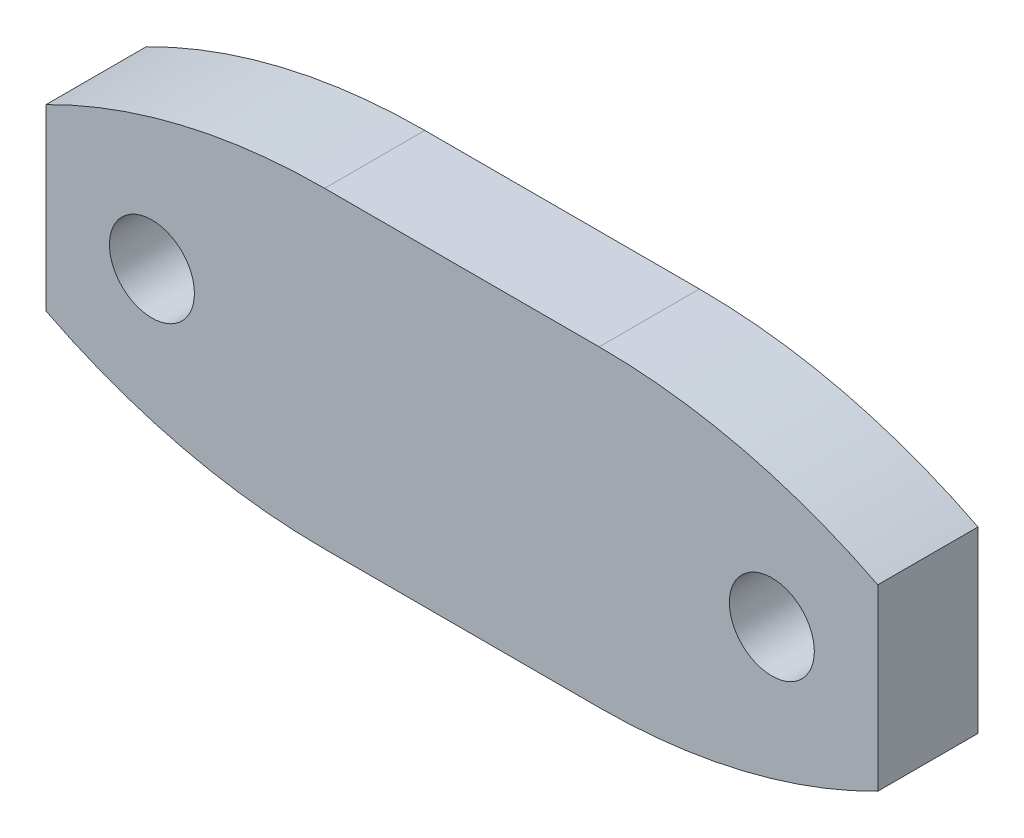
ISO-10303-21;
HEADER;
FILE_DESCRIPTION(('STEP AP214'),'2;1');
FILE_NAME('part.step','',(''),(''),'','','');
FILE_SCHEMA(('AUTOMOTIVE_DESIGN { 1 0 10303 214 1 1 1 1 }'));
ENDSEC;
DATA;
#1=APPLICATION_CONTEXT('core data for automotive mechanical design processes');
#2=APPLICATION_PROTOCOL_DEFINITION('international standard','automotive_design',2000,#1);
#3=PRODUCT_CONTEXT('',#1,'mechanical');
#4=PRODUCT('Part','Part','',(#3));
#5=PRODUCT_RELATED_PRODUCT_CATEGORY('part','',(#4));
#6=PRODUCT_DEFINITION_FORMATION('','',#4);
#7=PRODUCT_DEFINITION_CONTEXT('part definition',#1,'design');
#8=PRODUCT_DEFINITION('design','',#6,#7);
#9=PRODUCT_DEFINITION_SHAPE('','',#8);
#10=(LENGTH_UNIT() NAMED_UNIT(*) SI_UNIT(.MILLI.,.METRE.));
#11=(NAMED_UNIT(*) PLANE_ANGLE_UNIT() SI_UNIT($,.RADIAN.));
#12=(NAMED_UNIT(*) SI_UNIT($,.STERADIAN.) SOLID_ANGLE_UNIT());
#13=UNCERTAINTY_MEASURE_WITH_UNIT(LENGTH_MEASURE(1.E-05),#10,'distance_accuracy_value','');
#14=(GEOMETRIC_REPRESENTATION_CONTEXT(3) GLOBAL_UNCERTAINTY_ASSIGNED_CONTEXT((#13)) GLOBAL_UNIT_ASSIGNED_CONTEXT((#10,
#11,#12)) REPRESENTATION_CONTEXT('',''));
#15=CARTESIAN_POINT('',(0.,0.,0.));
#16=DIRECTION('',(0.,0.,1.));
#17=DIRECTION('',(1.,0.,0.));
#18=AXIS2_PLACEMENT_3D('',#15,#16,#17);
#19=CARTESIAN_POINT('',(0.,0.,7.7));
#20=DIRECTION('',(1.,0.,0.));
#21=DIRECTION('',(0.,0.,-1.));
#22=AXIS2_PLACEMENT_3D('',#19,#20,#21);
#23=PLANE('',#22);
#24=DIRECTION('',(0.,-1.,0.));
#25=VECTOR('',#24,1.);
#26=CARTESIAN_POINT('',(0.,0.,0.));
#27=LINE('',#26,#25);
#28=CARTESIAN_POINT('',(0.,18.8675854536362,0.));
#29=VERTEX_POINT('',#28);
#30=CARTESIAN_POINT('',(0.,5.13241454636384,0.));
#31=VERTEX_POINT('',#30);
#32=EDGE_CURVE('E138',#29,#31,#27,.T.);
#33=ORIENTED_EDGE('',*,*,#32,.T.);
#34=DIRECTION('',(0.,0.,1.));
#35=VECTOR('',#34,1.);
#36=CARTESIAN_POINT('',(0.,5.13241454636384,0.));
#37=LINE('',#36,#35);
#38=CARTESIAN_POINT('',(0.,5.13241454636384,7.7));
#39=VERTEX_POINT('',#38);
#40=EDGE_CURVE('E118',#31,#39,#37,.T.);
#41=ORIENTED_EDGE('',*,*,#40,.T.);
#42=DIRECTION('',(0.,-1.,0.));
#43=VECTOR('',#42,1.);
#44=CARTESIAN_POINT('',(0.,0.,7.7));
#45=LINE('',#44,#43);
#46=CARTESIAN_POINT('',(0.,18.8675854536362,7.7));
#47=VERTEX_POINT('',#46);
#48=EDGE_CURVE('E147',#47,#39,#45,.T.);
#49=ORIENTED_EDGE('',*,*,#48,.F.);
#50=DIRECTION('',(0.,0.,1.));
#51=VECTOR('',#50,1.);
#52=CARTESIAN_POINT('',(0.,18.8675854536362,0.));
#53=LINE('',#52,#51);
#54=EDGE_CURVE('E161',#29,#47,#53,.T.);
#55=ORIENTED_EDGE('',*,*,#54,.F.);
#56=EDGE_LOOP('',(#33,#41,#49,#55));
#57=FACE_BOUND('',#56,.T.);
#58=ADVANCED_FACE('F47',(#57),#23,.F.);
#59=CARTESIAN_POINT('',(63.9,0.,7.7));
#60=DIRECTION('',(-1.,0.,0.));
#61=DIRECTION('',(0.,0.,1.));
#62=AXIS2_PLACEMENT_3D('',#59,#60,#61);
#63=PLANE('',#62);
#64=DIRECTION('',(0.,1.,0.));
#65=VECTOR('',#64,1.);
#66=CARTESIAN_POINT('',(63.9,0.,0.));
#67=LINE('',#66,#65);
#68=CARTESIAN_POINT('',(63.9,5.13241454636386,0.));
#69=VERTEX_POINT('',#68);
#70=CARTESIAN_POINT('',(63.9,18.8675854536362,0.));
#71=VERTEX_POINT('',#70);
#72=EDGE_CURVE('E137',#69,#71,#67,.T.);
#73=ORIENTED_EDGE('',*,*,#72,.T.);
#74=DIRECTION('',(0.,0.,1.));
#75=VECTOR('',#74,1.);
#76=CARTESIAN_POINT('',(63.9,18.8675854536362,0.));
#77=LINE('',#76,#75);
#78=CARTESIAN_POINT('',(63.9,18.8675854536362,7.7));
#79=VERTEX_POINT('',#78);
#80=EDGE_CURVE('E71',#71,#79,#77,.T.);
#81=ORIENTED_EDGE('',*,*,#80,.T.);
#82=DIRECTION('',(0.,1.,0.));
#83=VECTOR('',#82,1.);
#84=CARTESIAN_POINT('',(63.9,0.,7.7));
#85=LINE('',#84,#83);
#86=CARTESIAN_POINT('',(63.9,5.13241454636386,7.7));
#87=VERTEX_POINT('',#86);
#88=EDGE_CURVE('E55',#87,#79,#85,.T.);
#89=ORIENTED_EDGE('',*,*,#88,.F.);
#90=DIRECTION('',(0.,0.,1.));
#91=VECTOR('',#90,1.);
#92=CARTESIAN_POINT('',(63.9,5.13241454636386,0.));
#93=LINE('',#92,#91);
#94=EDGE_CURVE('E180',#69,#87,#93,.T.);
#95=ORIENTED_EDGE('',*,*,#94,.F.);
#96=EDGE_LOOP('',(#73,#81,#89,#95));
#97=FACE_BOUND('',#96,.T.);
#98=ADVANCED_FACE('F203',(#97),#63,.F.);
#99=CARTESIAN_POINT('',(0.,0.,7.7));
#100=DIRECTION('',(0.,0.,-1.));
#101=DIRECTION('',(-1.,0.,0.));
#102=AXIS2_PLACEMENT_3D('',#99,#100,#101);
#103=PLANE('',#102);
#104=CARTESIAN_POINT('',(8.1375,12.,7.7));
#105=DIRECTION('',(0.,0.,1.));
#106=DIRECTION('',(1.,0.,0.));
#107=AXIS2_PLACEMENT_3D('',#104,#105,#106);
#108=CIRCLE('',#107,3.26389999999999);
#109=CARTESIAN_POINT('',(11.4014,12.,7.7));
#110=VERTEX_POINT('',#109);
#111=EDGE_CURVE('E158',#110,#110,#108,.T.);
#112=ORIENTED_EDGE('',*,*,#111,.F.);
#113=EDGE_LOOP('',(#112));
#114=FACE_BOUND('',#113,.T.);
#115=CARTESIAN_POINT('',(55.7625,12.,7.7));
#116=DIRECTION('',(0.,0.,1.));
#117=DIRECTION('',(1.,0.,0.));
#118=AXIS2_PLACEMENT_3D('',#115,#116,#117);
#119=CIRCLE('',#118,3.26389999999999);
#120=CARTESIAN_POINT('',(59.0264,12.,7.7));
#121=VERTEX_POINT('',#120);
#122=EDGE_CURVE('E152',#121,#121,#119,.T.);
#123=ORIENTED_EDGE('',*,*,#122,.F.);
#124=EDGE_LOOP('',(#123));
#125=FACE_BOUND('',#124,.T.);
#126=ORIENTED_EDGE('',*,*,#88,.T.);
#127=CARTESIAN_POINT('',(42.4970919465067,-23.1928122568759,7.7));
#128=DIRECTION('',(0.,0.,1.));
#129=DIRECTION('',(1.,0.,0.));
#130=AXIS2_PLACEMENT_3D('',#127,#128,#129);
#131=CIRCLE('',#130,47.1928122568759);
#132=CARTESIAN_POINT('',(42.4970919465067,24.,7.7));
#133=VERTEX_POINT('',#132);
#134=EDGE_CURVE('E176',#133,#79,#131,.F.);
#135=ORIENTED_EDGE('',*,*,#134,.F.);
#136=DIRECTION('',(-1.,0.,0.));
#137=VECTOR('',#136,1.);
#138=CARTESIAN_POINT('',(0.,24.,7.7));
#139=LINE('',#138,#137);
#140=CARTESIAN_POINT('',(21.4029080534933,24.,7.7));
#141=VERTEX_POINT('',#140);
#142=EDGE_CURVE('E11',#133,#141,#139,.T.);
#143=ORIENTED_EDGE('',*,*,#142,.T.);
#144=CARTESIAN_POINT('',(21.4029080534933,-23.1928122568759,7.7));
#145=DIRECTION('',(0.,0.,1.));
#146=DIRECTION('',(1.,0.,0.));
#147=AXIS2_PLACEMENT_3D('',#144,#145,#146);
#148=CIRCLE('',#147,47.1928122568759);
#149=EDGE_CURVE('E167',#141,#47,#148,.T.);
#150=ORIENTED_EDGE('',*,*,#149,.T.);
#151=ORIENTED_EDGE('',*,*,#48,.T.);
#152=CARTESIAN_POINT('',(21.4029080534933,47.1928122568759,7.7));
#153=DIRECTION('',(0.,0.,1.));
#154=DIRECTION('',(1.,0.,0.));
#155=AXIS2_PLACEMENT_3D('',#152,#153,#154);
#156=CIRCLE('',#155,47.1928122568759);
#157=CARTESIAN_POINT('',(21.4029080534933,0.,7.7));
#158=VERTEX_POINT('',#157);
#159=EDGE_CURVE('E123',#158,#39,#156,.F.);
#160=ORIENTED_EDGE('',*,*,#159,.F.);
#161=DIRECTION('',(1.,0.,0.));
#162=VECTOR('',#161,1.);
#163=CARTESIAN_POINT('',(0.,0.,7.7));
#164=LINE('',#163,#162);
#165=CARTESIAN_POINT('',(42.4970919465067,0.,7.7));
#166=VERTEX_POINT('',#165);
#167=EDGE_CURVE('E131',#158,#166,#164,.T.);
#168=ORIENTED_EDGE('',*,*,#167,.T.);
#169=CARTESIAN_POINT('',(42.4970919465067,47.1928122568759,7.7));
#170=DIRECTION('',(0.,0.,1.));
#171=DIRECTION('',(1.,0.,0.));
#172=AXIS2_PLACEMENT_3D('',#169,#170,#171);
#173=CIRCLE('',#172,47.1928122568759);
#174=EDGE_CURVE('E175',#166,#87,#173,.T.);
#175=ORIENTED_EDGE('',*,*,#174,.T.);
#176=EDGE_LOOP('',(#126,#135,#143,#150,#151,#160,#168,#175));
#177=FACE_BOUND('',#176,.T.);
#178=ADVANCED_FACE('F190',(#114,#125,#177),#103,.F.);
#179=CARTESIAN_POINT('',(0.,0.,0.));
#180=DIRECTION('',(0.,0.,-1.));
#181=DIRECTION('',(-1.,0.,0.));
#182=AXIS2_PLACEMENT_3D('',#179,#180,#181);
#183=PLANE('',#182);
#184=CARTESIAN_POINT('',(42.4970919465067,-23.1928122568759,0.));
#185=DIRECTION('',(0.,0.,1.));
#186=DIRECTION('',(1.,0.,0.));
#187=AXIS2_PLACEMENT_3D('',#184,#185,#186);
#188=CIRCLE('',#187,47.1928122568759);
#189=CARTESIAN_POINT('',(42.4970919465067,24.,0.));
#190=VERTEX_POINT('',#189);
#191=EDGE_CURVE('E173',#190,#71,#188,.F.);
#192=ORIENTED_EDGE('',*,*,#191,.T.);
#193=ORIENTED_EDGE('',*,*,#72,.F.);
#194=CARTESIAN_POINT('',(42.4970919465067,47.1928122568759,0.));
#195=DIRECTION('',(0.,0.,1.));
#196=DIRECTION('',(1.,0.,0.));
#197=AXIS2_PLACEMENT_3D('',#194,#195,#196);
#198=CIRCLE('',#197,47.1928122568759);
#199=CARTESIAN_POINT('',(42.4970919465067,0.,0.));
#200=VERTEX_POINT('',#199);
#201=EDGE_CURVE('E136',#200,#69,#198,.T.);
#202=ORIENTED_EDGE('',*,*,#201,.F.);
#203=DIRECTION('',(1.,0.,0.));
#204=VECTOR('',#203,1.);
#205=CARTESIAN_POINT('',(0.,0.,0.));
#206=LINE('',#205,#204);
#207=CARTESIAN_POINT('',(21.4029080534933,0.,0.));
#208=VERTEX_POINT('',#207);
#209=EDGE_CURVE('E129',#208,#200,#206,.T.);
#210=ORIENTED_EDGE('',*,*,#209,.F.);
#211=CARTESIAN_POINT('',(21.4029080534933,47.1928122568759,0.));
#212=DIRECTION('',(0.,0.,1.));
#213=DIRECTION('',(1.,0.,0.));
#214=AXIS2_PLACEMENT_3D('',#211,#212,#213);
#215=CIRCLE('',#214,47.1928122568759);
#216=EDGE_CURVE('E112',#208,#31,#215,.F.);
#217=ORIENTED_EDGE('',*,*,#216,.T.);
#218=ORIENTED_EDGE('',*,*,#32,.F.);
#219=CARTESIAN_POINT('',(21.4029080534933,-23.1928122568759,0.));
#220=DIRECTION('',(0.,0.,1.));
#221=DIRECTION('',(1.,0.,0.));
#222=AXIS2_PLACEMENT_3D('',#219,#220,#221);
#223=CIRCLE('',#222,47.1928122568759);
#224=CARTESIAN_POINT('',(21.4029080534933,24.,0.));
#225=VERTEX_POINT('',#224);
#226=EDGE_CURVE('E165',#225,#29,#223,.T.);
#227=ORIENTED_EDGE('',*,*,#226,.F.);
#228=DIRECTION('',(-1.,0.,0.));
#229=VECTOR('',#228,1.);
#230=CARTESIAN_POINT('',(0.,24.,0.));
#231=LINE('',#230,#229);
#232=EDGE_CURVE('E50',#190,#225,#231,.T.);
#233=ORIENTED_EDGE('',*,*,#232,.F.);
#234=EDGE_LOOP('',(#192,#193,#202,#210,#217,#218,#227,#233));
#235=FACE_BOUND('',#234,.T.);
#236=CARTESIAN_POINT('',(8.1375,12.,0.));
#237=DIRECTION('',(0.,0.,1.));
#238=DIRECTION('',(1.,0.,0.));
#239=AXIS2_PLACEMENT_3D('',#236,#237,#238);
#240=CIRCLE('',#239,3.26389999999999);
#241=CARTESIAN_POINT('',(11.4014,12.,0.));
#242=VERTEX_POINT('',#241);
#243=EDGE_CURVE('E155',#242,#242,#240,.T.);
#244=ORIENTED_EDGE('',*,*,#243,.T.);
#245=EDGE_LOOP('',(#244));
#246=FACE_BOUND('',#245,.T.);
#247=CARTESIAN_POINT('',(55.7625,12.,0.));
#248=DIRECTION('',(0.,0.,1.));
#249=DIRECTION('',(1.,0.,0.));
#250=AXIS2_PLACEMENT_3D('',#247,#248,#249);
#251=CIRCLE('',#250,3.26389999999999);
#252=CARTESIAN_POINT('',(59.0264,12.,0.));
#253=VERTEX_POINT('',#252);
#254=EDGE_CURVE('E141',#253,#253,#251,.T.);
#255=ORIENTED_EDGE('',*,*,#254,.T.);
#256=EDGE_LOOP('',(#255));
#257=FACE_BOUND('',#256,.T.);
#258=ADVANCED_FACE('F133',(#235,#246,#257),#183,.T.);
#259=CARTESIAN_POINT('',(0.,0.,7.7));
#260=DIRECTION('',(0.,1.,0.));
#261=DIRECTION('',(0.,0.,1.));
#262=AXIS2_PLACEMENT_3D('',#259,#260,#261);
#263=PLANE('',#262);
#264=ORIENTED_EDGE('',*,*,#209,.T.);
#265=DIRECTION('',(0.,0.,1.));
#266=VECTOR('',#265,1.);
#267=CARTESIAN_POINT('',(42.4970919465067,0.,0.));
#268=LINE('',#267,#266);
#269=EDGE_CURVE('E63',#200,#166,#268,.T.);
#270=ORIENTED_EDGE('',*,*,#269,.T.);
#271=ORIENTED_EDGE('',*,*,#167,.F.);
#272=DIRECTION('',(0.,0.,1.));
#273=VECTOR('',#272,1.);
#274=CARTESIAN_POINT('',(21.4029080534933,0.,0.));
#275=LINE('',#274,#273);
#276=EDGE_CURVE('E115',#208,#158,#275,.T.);
#277=ORIENTED_EDGE('',*,*,#276,.F.);
#278=EDGE_LOOP('',(#264,#270,#271,#277));
#279=FACE_BOUND('',#278,.T.);
#280=ADVANCED_FACE('F128',(#279),#263,.F.);
#281=CARTESIAN_POINT('',(0.,24.,7.7));
#282=DIRECTION('',(0.,-1.,0.));
#283=DIRECTION('',(0.,0.,-1.));
#284=AXIS2_PLACEMENT_3D('',#281,#282,#283);
#285=PLANE('',#284);
#286=ORIENTED_EDGE('',*,*,#142,.F.);
#287=DIRECTION('',(0.,0.,1.));
#288=VECTOR('',#287,1.);
#289=CARTESIAN_POINT('',(42.4970919465067,24.,0.));
#290=LINE('',#289,#288);
#291=EDGE_CURVE('E171',#190,#133,#290,.T.);
#292=ORIENTED_EDGE('',*,*,#291,.F.);
#293=ORIENTED_EDGE('',*,*,#232,.T.);
#294=DIRECTION('',(0.,0.,1.));
#295=VECTOR('',#294,1.);
#296=CARTESIAN_POINT('',(21.4029080534933,24.,0.));
#297=LINE('',#296,#295);
#298=EDGE_CURVE('E162',#225,#141,#297,.T.);
#299=ORIENTED_EDGE('',*,*,#298,.T.);
#300=EDGE_LOOP('',(#286,#292,#293,#299));
#301=FACE_BOUND('',#300,.T.);
#302=ADVANCED_FACE('F198',(#301),#285,.F.);
#303=CARTESIAN_POINT('',(55.7625,12.,7.7));
#304=DIRECTION('',(0.,0.,1.));
#305=DIRECTION('',(1.,0.,0.));
#306=AXIS2_PLACEMENT_3D('',#303,#304,#305);
#307=CYLINDRICAL_SURFACE('',#306,3.26389999999999);
#308=ORIENTED_EDGE('',*,*,#254,.F.);
#309=EDGE_LOOP('',(#308));
#310=FACE_BOUND('',#309,.T.);
#311=ORIENTED_EDGE('',*,*,#122,.T.);
#312=EDGE_LOOP('',(#311));
#313=FACE_BOUND('',#312,.T.);
#314=ADVANCED_FACE('F232',(#310,#313),#307,.F.);
#315=CARTESIAN_POINT('',(8.1375,12.,7.7));
#316=DIRECTION('',(0.,0.,1.));
#317=DIRECTION('',(1.,0.,0.));
#318=AXIS2_PLACEMENT_3D('',#315,#316,#317);
#319=CYLINDRICAL_SURFACE('',#318,3.26389999999999);
#320=ORIENTED_EDGE('',*,*,#243,.F.);
#321=EDGE_LOOP('',(#320));
#322=FACE_BOUND('',#321,.T.);
#323=ORIENTED_EDGE('',*,*,#111,.T.);
#324=EDGE_LOOP('',(#323));
#325=FACE_BOUND('',#324,.T.);
#326=ADVANCED_FACE('F238',(#322,#325),#319,.F.);
#327=CARTESIAN_POINT('',(21.4029080534933,-23.1928122568759,0.));
#328=DIRECTION('',(0.,0.,1.));
#329=DIRECTION('',(1.,0.,0.));
#330=AXIS2_PLACEMENT_3D('',#327,#328,#329);
#331=CYLINDRICAL_SURFACE('',#330,47.1928122568759);
#332=ORIENTED_EDGE('',*,*,#149,.F.);
#333=ORIENTED_EDGE('',*,*,#298,.F.);
#334=ORIENTED_EDGE('',*,*,#226,.T.);
#335=ORIENTED_EDGE('',*,*,#54,.T.);
#336=EDGE_LOOP('',(#332,#333,#334,#335));
#337=FACE_BOUND('',#336,.T.);
#338=ADVANCED_FACE('F194',(#337),#331,.T.);
#339=CARTESIAN_POINT('',(21.4029080534933,47.1928122568759,0.));
#340=DIRECTION('',(0.,0.,1.));
#341=DIRECTION('',(1.,0.,0.));
#342=AXIS2_PLACEMENT_3D('',#339,#340,#341);
#343=CYLINDRICAL_SURFACE('',#342,47.1928122568759);
#344=ORIENTED_EDGE('',*,*,#159,.T.);
#345=ORIENTED_EDGE('',*,*,#40,.F.);
#346=ORIENTED_EDGE('',*,*,#216,.F.);
#347=ORIENTED_EDGE('',*,*,#276,.T.);
#348=EDGE_LOOP('',(#344,#345,#346,#347));
#349=FACE_BOUND('',#348,.T.);
#350=ADVANCED_FACE('F114',(#349),#343,.T.);
#351=CARTESIAN_POINT('',(42.4970919465067,47.1928122568759,0.));
#352=DIRECTION('',(0.,0.,1.));
#353=DIRECTION('',(1.,0.,0.));
#354=AXIS2_PLACEMENT_3D('',#351,#352,#353);
#355=CYLINDRICAL_SURFACE('',#354,47.1928122568759);
#356=ORIENTED_EDGE('',*,*,#174,.F.);
#357=ORIENTED_EDGE('',*,*,#269,.F.);
#358=ORIENTED_EDGE('',*,*,#201,.T.);
#359=ORIENTED_EDGE('',*,*,#94,.T.);
#360=EDGE_LOOP('',(#356,#357,#358,#359));
#361=FACE_BOUND('',#360,.T.);
#362=ADVANCED_FACE('F205',(#361),#355,.T.);
#363=CARTESIAN_POINT('',(42.4970919465067,-23.1928122568759,0.));
#364=DIRECTION('',(0.,0.,1.));
#365=DIRECTION('',(1.,0.,0.));
#366=AXIS2_PLACEMENT_3D('',#363,#364,#365);
#367=CYLINDRICAL_SURFACE('',#366,47.1928122568759);
#368=ORIENTED_EDGE('',*,*,#134,.T.);
#369=ORIENTED_EDGE('',*,*,#80,.F.);
#370=ORIENTED_EDGE('',*,*,#191,.F.);
#371=ORIENTED_EDGE('',*,*,#291,.T.);
#372=EDGE_LOOP('',(#368,#369,#370,#371));
#373=FACE_BOUND('',#372,.T.);
#374=ADVANCED_FACE('F206',(#373),#367,.T.);
#375=CLOSED_SHELL('',(#58,#98,#178,#258,#280,#302,#314,#326,#338,#350,#362,#374));
#376=MANIFOLD_SOLID_BREP('B2',#375);
#377=ADVANCED_BREP_SHAPE_REPRESENTATION('',(#18,#376),#14);
#378=SHAPE_DEFINITION_REPRESENTATION(#9,#377);
ENDSEC;
END-ISO-10303-21;
